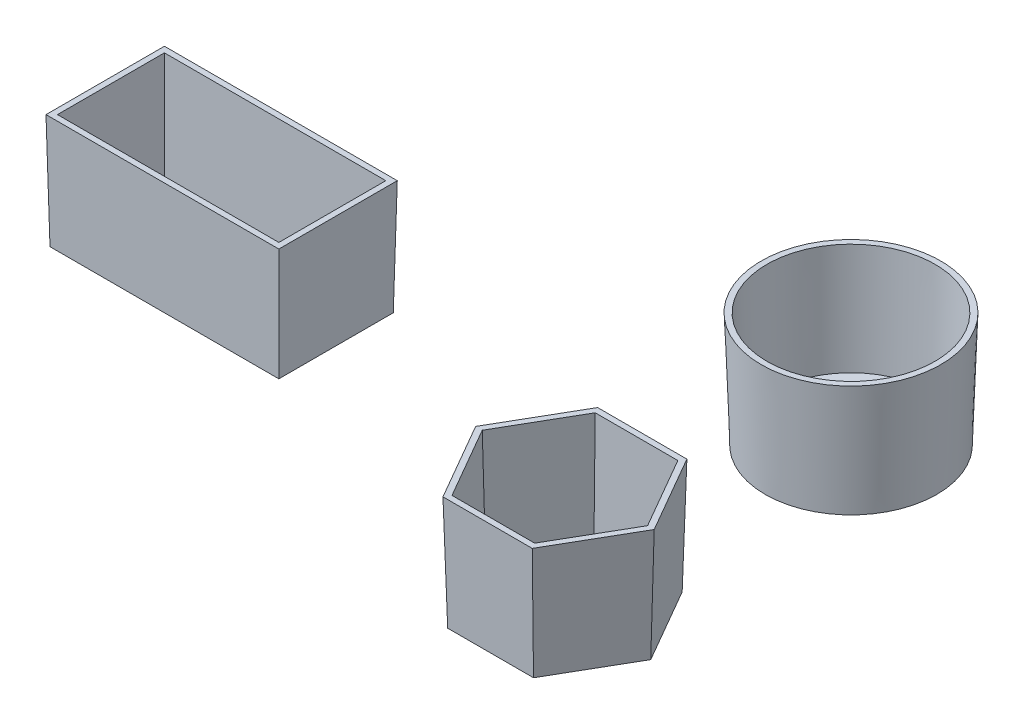
ISO-10303-21;
HEADER;
FILE_DESCRIPTION(('STEP AP214'),'2;1');
FILE_NAME('part.step','',(''),(''),'','','');
FILE_SCHEMA(('AUTOMOTIVE_DESIGN { 1 0 10303 214 1 1 1 1 }'));
ENDSEC;
DATA;
#1=APPLICATION_CONTEXT('core data for automotive mechanical design processes');
#2=APPLICATION_PROTOCOL_DEFINITION('international standard','automotive_design',2000,#1);
#3=PRODUCT_CONTEXT('',#1,'mechanical');
#4=PRODUCT('Part','Part','',(#3));
#5=PRODUCT_RELATED_PRODUCT_CATEGORY('part','',(#4));
#6=PRODUCT_DEFINITION_FORMATION('','',#4);
#7=PRODUCT_DEFINITION_CONTEXT('part definition',#1,'design');
#8=PRODUCT_DEFINITION('design','',#6,#7);
#9=PRODUCT_DEFINITION_SHAPE('','',#8);
#10=(LENGTH_UNIT() NAMED_UNIT(*) SI_UNIT(.MILLI.,.METRE.));
#11=(NAMED_UNIT(*) PLANE_ANGLE_UNIT() SI_UNIT($,.RADIAN.));
#12=(NAMED_UNIT(*) SI_UNIT($,.STERADIAN.) SOLID_ANGLE_UNIT());
#13=UNCERTAINTY_MEASURE_WITH_UNIT(LENGTH_MEASURE(1.E-05),#10,'distance_accuracy_value','');
#14=(GEOMETRIC_REPRESENTATION_CONTEXT(3) GLOBAL_UNCERTAINTY_ASSIGNED_CONTEXT((#13)) GLOBAL_UNIT_ASSIGNED_CONTEXT((#10,
#11,#12)) REPRESENTATION_CONTEXT('',''));
#15=CARTESIAN_POINT('',(0.,0.,0.));
#16=DIRECTION('',(0.,0.,1.));
#17=DIRECTION('',(1.,0.,0.));
#18=AXIS2_PLACEMENT_3D('',#15,#16,#17);
#19=CARTESIAN_POINT('',(0.,0.,32.9903810567666));
#20=DIRECTION('',(0.,-0.0261769483078732,0.999657324975557));
#21=DIRECTION('',(0.,-0.999657324975557,-0.0261769483078732));
#22=AXIS2_PLACEMENT_3D('',#19,#20,#21);
#23=PLANE('',#22);
#24=DIRECTION('',(1.,0.,0.));
#25=VECTOR('',#24,1.);
#26=CARTESIAN_POINT('',(0.,0.,32.9903810567666));
#27=LINE('',#26,#25);
#28=CARTESIAN_POINT('',(27.5,0.,32.9903810567666));
#29=VERTEX_POINT('',#28);
#30=CARTESIAN_POINT('',(42.5,0.,32.9903810567666));
#31=VERTEX_POINT('',#30);
#32=EDGE_CURVE('E200',#29,#31,#27,.T.);
#33=ORIENTED_EDGE('',*,*,#32,.T.);
#34=DIRECTION('',(-0.0151115424303425,-0.999543178227686,-0.0261739592700861));
#35=VECTOR('',#34,1.);
#36=CARTESIAN_POINT('',(42.4983282981855,-0.110573632868768,32.9874855842887));
#37=LINE('',#36,#35);
#38=CARTESIAN_POINT('',(42.802368977339,20.,33.5140994881503));
#39=VERTEX_POINT('',#38);
#40=EDGE_CURVE('E12',#39,#31,#37,.T.);
#41=ORIENTED_EDGE('',*,*,#40,.F.);
#42=DIRECTION('',(-1.,0.,0.));
#43=VECTOR('',#42,1.);
#44=CARTESIAN_POINT('',(0.,20.,33.5140994881503));
#45=LINE('',#44,#43);
#46=CARTESIAN_POINT('',(27.197631022661,20.,33.5140994881503));
#47=VERTEX_POINT('',#46);
#48=EDGE_CURVE('E212',#47,#39,#45,.F.);
#49=ORIENTED_EDGE('',*,*,#48,.F.);
#50=DIRECTION('',(0.0151115424303425,-0.999543178227686,-0.0261739592700861));
#51=VECTOR('',#50,1.);
#52=CARTESIAN_POINT('',(27.4937201353478,0.415377576590544,33.0012581014088));
#53=LINE('',#52,#51);
#54=EDGE_CURVE('E214',#47,#29,#53,.T.);
#55=ORIENTED_EDGE('',*,*,#54,.T.);
#56=EDGE_LOOP('',(#33,#41,#49,#55));
#57=FACE_BOUND('',#56,.T.);
#58=ADVANCED_FACE('F59',(#57),#23,.T.);
#59=CARTESIAN_POINT('',(46.1602540378444,0.,26.6506350946109));
#60=DIRECTION('',(0.865728638508029,-0.0261769483078732,0.499828662487778));
#61=DIRECTION('',(0.499999999999999,0.,-0.866025403784439));
#62=AXIS2_PLACEMENT_3D('',#59,#60,#61);
#63=PLANE('',#62);
#64=DIRECTION('',(0.499999999999999,0.,-0.866025403784439));
#65=VECTOR('',#64,1.);
#66=CARTESIAN_POINT('',(46.1602540378444,0.,26.6506350946109));
#67=LINE('',#66,#65);
#68=CARTESIAN_POINT('',(50.,0.,20.));
#69=VERTEX_POINT('',#68);
#70=EDGE_CURVE('E203',#31,#69,#67,.T.);
#71=ORIENTED_EDGE('',*,*,#70,.T.);
#72=DIRECTION('',(-0.030223084860685,-0.999543178227686,0.));
#73=VECTOR('',#72,1.);
#74=CARTESIAN_POINT('',(49.9806714863472,-0.639236003074915,20.));
#75=LINE('',#74,#73);
#76=CARTESIAN_POINT('',(50.6047379546779,20.,20.));
#77=VERTEX_POINT('',#76);
#78=EDGE_CURVE('E68',#77,#69,#75,.T.);
#79=ORIENTED_EDGE('',*,*,#78,.F.);
#80=DIRECTION('',(-0.499999999999999,0.,0.866025403784439));
#81=VECTOR('',#80,1.);
#82=CARTESIAN_POINT('',(46.6138075038529,20.,26.9124943103028));
#83=LINE('',#82,#81);
#84=EDGE_CURVE('E229',#39,#77,#83,.F.);
#85=ORIENTED_EDGE('',*,*,#84,.F.);
#86=ORIENTED_EDGE('',*,*,#40,.T.);
#87=EDGE_LOOP('',(#71,#79,#85,#86));
#88=FACE_BOUND('',#87,.T.);
#89=ADVANCED_FACE('F61',(#88),#63,.T.);
#90=CARTESIAN_POINT('',(28.8397459621556,0.,-16.650635094611));
#91=DIRECTION('',(0.865728638508029,-0.0261769483078732,-0.499828662487779));
#92=DIRECTION('',(-0.5,0.,-0.866025403784439));
#93=AXIS2_PLACEMENT_3D('',#90,#91,#92);
#94=PLANE('',#93);
#95=DIRECTION('',(-0.5,0.,-0.866025403784439));
#96=VECTOR('',#95,1.);
#97=CARTESIAN_POINT('',(28.8397459621556,0.,-16.650635094611));
#98=LINE('',#97,#96);
#99=CARTESIAN_POINT('',(42.5,0.,7.00961894323341));
#100=VERTEX_POINT('',#99);
#101=EDGE_CURVE('E205',#69,#100,#98,.T.);
#102=ORIENTED_EDGE('',*,*,#101,.T.);
#103=DIRECTION('',(-0.0151115424303425,-0.999543178227686,0.0261739592700861));
#104=VECTOR('',#103,1.);
#105=CARTESIAN_POINT('',(42.4902947546285,-0.64194716382175,7.0264289213168));
#106=LINE('',#105,#104);
#107=CARTESIAN_POINT('',(42.802368977339,20.,6.48590051184967));
#108=VERTEX_POINT('',#107);
#109=EDGE_CURVE('E223',#108,#100,#106,.T.);
#110=ORIENTED_EDGE('',*,*,#109,.F.);
#111=DIRECTION('',(0.5,0.,0.866025403784439));
#112=VECTOR('',#111,1.);
#113=CARTESIAN_POINT('',(29.2932994281641,20.,-16.9124943103028));
#114=LINE('',#113,#112);
#115=EDGE_CURVE('E231',#77,#108,#114,.F.);
#116=ORIENTED_EDGE('',*,*,#115,.F.);
#117=ORIENTED_EDGE('',*,*,#78,.T.);
#118=EDGE_LOOP('',(#102,#110,#116,#117));
#119=FACE_BOUND('',#118,.T.);
#120=ADVANCED_FACE('F256',(#119),#94,.T.);
#121=CARTESIAN_POINT('',(0.,0.,7.00961894323341));
#122=DIRECTION('',(0.,-0.0261769483078732,-0.999657324975557));
#123=DIRECTION('',(0.,0.999657324975557,-0.0261769483078732));
#124=AXIS2_PLACEMENT_3D('',#121,#122,#123);
#125=PLANE('',#124);
#126=DIRECTION('',(-1.,0.,0.));
#127=VECTOR('',#126,1.);
#128=CARTESIAN_POINT('',(0.,0.,7.00961894323341));
#129=LINE('',#128,#127);
#130=CARTESIAN_POINT('',(27.5,0.,7.00961894323341));
#131=VERTEX_POINT('',#130);
#132=EDGE_CURVE('E207',#100,#131,#129,.T.);
#133=ORIENTED_EDGE('',*,*,#132,.T.);
#134=DIRECTION('',(0.0151115424303425,-0.999543178227686,0.0261739592700861));
#135=VECTOR('',#134,1.);
#136=CARTESIAN_POINT('',(27.5017536789048,-0.115995954362438,7.01265640419668));
#137=LINE('',#136,#135);
#138=CARTESIAN_POINT('',(27.197631022661,20.,6.48590051184967));
#139=VERTEX_POINT('',#138);
#140=EDGE_CURVE('E220',#139,#131,#137,.T.);
#141=ORIENTED_EDGE('',*,*,#140,.F.);
#142=DIRECTION('',(1.,0.,0.));
#143=VECTOR('',#142,1.);
#144=CARTESIAN_POINT('',(0.,20.,6.48590051184967));
#145=LINE('',#144,#143);
#146=EDGE_CURVE('E233',#108,#139,#145,.F.);
#147=ORIENTED_EDGE('',*,*,#146,.F.);
#148=ORIENTED_EDGE('',*,*,#109,.T.);
#149=EDGE_LOOP('',(#133,#141,#147,#148));
#150=FACE_BOUND('',#149,.T.);
#151=ADVANCED_FACE('F259',(#150),#125,.T.);
#152=CARTESIAN_POINT('',(23.6602540378444,0.,13.6602540378444));
#153=DIRECTION('',(-0.865728638508029,-0.0261769483078732,-0.499828662487779));
#154=DIRECTION('',(-0.5,0.,0.866025403784439));
#155=AXIS2_PLACEMENT_3D('',#152,#153,#154);
#156=PLANE('',#155);
#157=DIRECTION('',(-0.5,0.,0.866025403784439));
#158=VECTOR('',#157,1.);
#159=CARTESIAN_POINT('',(23.6602540378444,0.,13.6602540378444));
#160=LINE('',#159,#158);
#161=CARTESIAN_POINT('',(20.,0.,20.));
#162=VERTEX_POINT('',#161);
#163=EDGE_CURVE('E209',#131,#162,#160,.T.);
#164=ORIENTED_EDGE('',*,*,#163,.T.);
#165=DIRECTION('',(0.030223084860685,-0.999543178227686,0.));
#166=VECTOR('',#165,1.);
#167=CARTESIAN_POINT('',(19.9875222477859,0.412666415843709,20.));
#168=LINE('',#167,#166);
#169=CARTESIAN_POINT('',(19.3952620453221,20.,20.));
#170=VERTEX_POINT('',#169);
#171=EDGE_CURVE('E217',#170,#162,#168,.T.);
#172=ORIENTED_EDGE('',*,*,#171,.F.);
#173=DIRECTION('',(0.5,0.,-0.866025403784439));
#174=VECTOR('',#173,1.);
#175=CARTESIAN_POINT('',(23.2067005718359,20.,13.3983948221525));
#176=LINE('',#175,#174);
#177=EDGE_CURVE('E234',#139,#170,#176,.F.);
#178=ORIENTED_EDGE('',*,*,#177,.F.);
#179=ORIENTED_EDGE('',*,*,#140,.T.);
#180=EDGE_LOOP('',(#164,#172,#178,#179));
#181=FACE_BOUND('',#180,.T.);
#182=ADVANCED_FACE('F241',(#181),#156,.T.);
#183=CARTESIAN_POINT('',(6.3397459621556,0.,-3.66025403784438));
#184=DIRECTION('',(-0.865728638508029,-0.0261769483078732,0.499828662487779));
#185=DIRECTION('',(0.5,0.,0.866025403784439));
#186=AXIS2_PLACEMENT_3D('',#183,#184,#185);
#187=PLANE('',#186);
#188=DIRECTION('',(0.5,0.,0.866025403784439));
#189=VECTOR('',#188,1.);
#190=CARTESIAN_POINT('',(6.3397459621556,0.,-3.66025403784438));
#191=LINE('',#190,#189);
#192=EDGE_CURVE('E211',#162,#29,#191,.T.);
#193=ORIENTED_EDGE('',*,*,#192,.T.);
#194=ORIENTED_EDGE('',*,*,#54,.F.);
#195=DIRECTION('',(-0.5,0.,-0.866025403784439));
#196=VECTOR('',#195,1.);
#197=CARTESIAN_POINT('',(5.88619249614715,20.,-3.39839482215251));
#198=LINE('',#197,#196);
#199=EDGE_CURVE('E63',#170,#47,#198,.F.);
#200=ORIENTED_EDGE('',*,*,#199,.F.);
#201=ORIENTED_EDGE('',*,*,#171,.T.);
#202=EDGE_LOOP('',(#193,#194,#200,#201));
#203=FACE_BOUND('',#202,.T.);
#204=ADVANCED_FACE('F245',(#203),#187,.T.);
#205=CARTESIAN_POINT('',(0.,20.,0.));
#206=DIRECTION('',(0.,1.,0.));
#207=DIRECTION('',(0.,0.,1.));
#208=AXIS2_PLACEMENT_3D('',#205,#206,#207);
#209=PLANE('',#208);
#210=DIRECTION('',(-1.,0.,0.));
#211=VECTOR('',#210,1.);
#212=CARTESIAN_POINT('',(0.,20.,32.5137566956595));
#213=LINE('',#212,#211);
#214=CARTESIAN_POINT('',(27.7751792031875,20.,32.5137566956595));
#215=VERTEX_POINT('',#214);
#216=CARTESIAN_POINT('',(42.2248207968125,20.,32.5137566956595));
#217=VERTEX_POINT('',#216);
#218=EDGE_CURVE('E189',#215,#217,#213,.F.);
#219=ORIENTED_EDGE('',*,*,#218,.F.);
#220=DIRECTION('',(-0.5,0.,-0.866025403784439));
#221=VECTOR('',#220,1.);
#222=CARTESIAN_POINT('',(6.75251476693691,20.,-3.89856621839795));
#223=LINE('',#222,#221);
#224=CARTESIAN_POINT('',(20.5503584063751,20.,20.));
#225=VERTEX_POINT('',#224);
#226=EDGE_CURVE('E198',#225,#215,#223,.F.);
#227=ORIENTED_EDGE('',*,*,#226,.F.);
#228=DIRECTION('',(0.5,0.,-0.866025403784439));
#229=VECTOR('',#228,1.);
#230=CARTESIAN_POINT('',(24.0730228426257,20.,13.8985662183979));
#231=LINE('',#230,#229);
#232=CARTESIAN_POINT('',(27.7751792031875,20.,7.48624330434053));
#233=VERTEX_POINT('',#232);
#234=EDGE_CURVE('E196',#233,#225,#231,.F.);
#235=ORIENTED_EDGE('',*,*,#234,.F.);
#236=DIRECTION('',(1.,0.,0.));
#237=VECTOR('',#236,1.);
#238=CARTESIAN_POINT('',(0.,20.,7.48624330434053));
#239=LINE('',#238,#237);
#240=CARTESIAN_POINT('',(42.2248207968125,20.,7.48624330434053));
#241=VERTEX_POINT('',#240);
#242=EDGE_CURVE('E194',#241,#233,#239,.F.);
#243=ORIENTED_EDGE('',*,*,#242,.F.);
#244=DIRECTION('',(0.5,0.,0.866025403784439));
#245=VECTOR('',#244,1.);
#246=CARTESIAN_POINT('',(28.4269771573743,20.,-16.4123229140574));
#247=LINE('',#246,#245);
#248=CARTESIAN_POINT('',(49.4496415936249,20.,20.));
#249=VERTEX_POINT('',#248);
#250=EDGE_CURVE('E192',#249,#241,#247,.F.);
#251=ORIENTED_EDGE('',*,*,#250,.F.);
#252=DIRECTION('',(-0.499999999999999,0.,0.866025403784439));
#253=VECTOR('',#252,1.);
#254=CARTESIAN_POINT('',(45.7474852330631,20.,26.4123229140574));
#255=LINE('',#254,#253);
#256=EDGE_CURVE('E166',#217,#249,#255,.F.);
#257=ORIENTED_EDGE('',*,*,#256,.F.);
#258=EDGE_LOOP('',(#219,#227,#235,#243,#251,#257));
#259=FACE_BOUND('',#258,.T.);
#260=ORIENTED_EDGE('',*,*,#48,.T.);
#261=ORIENTED_EDGE('',*,*,#84,.T.);
#262=ORIENTED_EDGE('',*,*,#115,.T.);
#263=ORIENTED_EDGE('',*,*,#146,.T.);
#264=ORIENTED_EDGE('',*,*,#177,.T.);
#265=ORIENTED_EDGE('',*,*,#199,.T.);
#266=EDGE_LOOP('',(#260,#261,#262,#263,#264,#265));
#267=FACE_BOUND('',#266,.T.);
#268=ADVANCED_FACE('F237',(#259,#267),#209,.T.);
#269=CARTESIAN_POINT('',(0.,0.,0.));
#270=DIRECTION('',(0.,1.,0.));
#271=DIRECTION('',(0.,0.,1.));
#272=AXIS2_PLACEMENT_3D('',#269,#270,#271);
#273=PLANE('',#272);
#274=ORIENTED_EDGE('',*,*,#32,.F.);
#275=ORIENTED_EDGE('',*,*,#192,.F.);
#276=ORIENTED_EDGE('',*,*,#163,.F.);
#277=ORIENTED_EDGE('',*,*,#132,.F.);
#278=ORIENTED_EDGE('',*,*,#101,.F.);
#279=ORIENTED_EDGE('',*,*,#70,.F.);
#280=EDGE_LOOP('',(#274,#275,#276,#277,#278,#279));
#281=FACE_BOUND('',#280,.T.);
#282=ADVANCED_FACE('F261',(#281),#273,.F.);
#283=CARTESIAN_POINT('',(0.,0.0261769483078732,31.990723731791));
#284=DIRECTION('',(0.,-0.0261769483078732,0.999657324975557));
#285=DIRECTION('',(0.,-0.999657324975557,-0.0261769483078732));
#286=AXIS2_PLACEMENT_3D('',#283,#284,#285);
#287=PLANE('',#286);
#288=DIRECTION('',(-1.,0.,0.));
#289=VECTOR('',#288,1.);
#290=CARTESIAN_POINT('',(0.,1.,32.0162241858449));
#291=LINE('',#290,#289);
#292=CARTESIAN_POINT('',(28.0624297316596,1.,32.0162241858449));
#293=VERTEX_POINT('',#292);
#294=CARTESIAN_POINT('',(41.9375702683405,1.,32.0162241858449));
#295=VERTEX_POINT('',#294);
#296=EDGE_CURVE('E157',#293,#295,#291,.F.);
#297=ORIENTED_EDGE('',*,*,#296,.F.);
#298=DIRECTION('',(0.0151115424303425,-0.999543178227686,-0.0261739592700861));
#299=VECTOR('',#298,1.);
#300=CARTESIAN_POINT('',(28.0707407632338,0.450272204022017,32.001829056895));
#301=LINE('',#300,#299);
#302=EDGE_CURVE('E187',#215,#293,#301,.T.);
#303=ORIENTED_EDGE('',*,*,#302,.F.);
#304=ORIENTED_EDGE('',*,*,#218,.T.);
#305=DIRECTION('',(-0.0151115424303425,-0.999543178227686,-0.0261739592700861));
#306=VECTOR('',#305,1.);
#307=CARTESIAN_POINT('',(41.9213076702995,-0.0756790054372952,31.9880565397749));
#308=LINE('',#307,#306);
#309=EDGE_CURVE('E169',#217,#295,#308,.T.);
#310=ORIENTED_EDGE('',*,*,#309,.T.);
#311=EDGE_LOOP('',(#297,#303,#304,#310));
#312=FACE_BOUND('',#311,.T.);
#313=ADVANCED_FACE('F263',(#312),#287,.F.);
#314=CARTESIAN_POINT('',(45.2945253993364,0.0261769483078732,26.1508064321232));
#315=DIRECTION('',(0.865728638508029,-0.0261769483078732,0.499828662487778));
#316=DIRECTION('',(0.499999999999999,0.,-0.866025403784439));
#317=AXIS2_PLACEMENT_3D('',#314,#315,#316);
#318=PLANE('',#317);
#319=DIRECTION('',(-0.499999999999999,0.,0.866025403784439));
#320=VECTOR('',#319,1.);
#321=CARTESIAN_POINT('',(45.3166094403551,1.,26.1635566591501));
#322=LINE('',#321,#320);
#323=CARTESIAN_POINT('',(48.8751405366809,1.,20.));
#324=VERTEX_POINT('',#323);
#325=EDGE_CURVE('E150',#295,#324,#322,.F.);
#326=ORIENTED_EDGE('',*,*,#325,.F.);
#327=ORIENTED_EDGE('',*,*,#309,.F.);
#328=ORIENTED_EDGE('',*,*,#256,.T.);
#329=DIRECTION('',(-0.030223084860685,-0.999543178227686,0.));
#330=VECTOR('',#329,1.);
#331=CARTESIAN_POINT('',(48.8266302305753,-0.604341375643442,20.));
#332=LINE('',#331,#330);
#333=EDGE_CURVE('E163',#249,#324,#332,.T.);
#334=ORIENTED_EDGE('',*,*,#333,.T.);
#335=EDGE_LOOP('',(#326,#327,#328,#334));
#336=FACE_BOUND('',#335,.T.);
#337=ADVANCED_FACE('F164',(#336),#318,.F.);
#338=CARTESIAN_POINT('',(27.9740173236476,0.0261769483078732,-16.1508064321232));
#339=DIRECTION('',(0.865728638508029,-0.0261769483078732,-0.499828662487779));
#340=DIRECTION('',(-0.5,0.,-0.866025403784439));
#341=AXIS2_PLACEMENT_3D('',#338,#339,#340);
#342=PLANE('',#341);
#343=DIRECTION('',(0.5,0.,0.866025403784439));
#344=VECTOR('',#343,1.);
#345=CARTESIAN_POINT('',(27.9961013646663,1.,-16.1635566591501));
#346=LINE('',#345,#344);
#347=CARTESIAN_POINT('',(41.9375702683404,1.,7.98377581415509));
#348=VERTEX_POINT('',#347);
#349=EDGE_CURVE('E154',#324,#348,#346,.F.);
#350=ORIENTED_EDGE('',*,*,#349,.F.);
#351=ORIENTED_EDGE('',*,*,#333,.F.);
#352=ORIENTED_EDGE('',*,*,#250,.T.);
#353=DIRECTION('',(-0.0151115424303425,-0.999543178227686,0.0261739592700861));
#354=VECTOR('',#353,1.);
#355=CARTESIAN_POINT('',(41.9132741267425,-0.607052536390277,8.02585796583057));
#356=LINE('',#355,#354);
#357=EDGE_CURVE('E170',#241,#348,#356,.T.);
#358=ORIENTED_EDGE('',*,*,#357,.T.);
#359=EDGE_LOOP('',(#350,#351,#352,#358));
#360=FACE_BOUND('',#359,.T.);
#361=ADVANCED_FACE('F172',(#360),#342,.F.);
#362=CARTESIAN_POINT('',(0.,0.0261769483078732,8.00927626820896));
#363=DIRECTION('',(0.,-0.0261769483078732,-0.999657324975557));
#364=DIRECTION('',(0.,0.999657324975557,-0.0261769483078732));
#365=AXIS2_PLACEMENT_3D('',#362,#363,#364);
#366=PLANE('',#365);
#367=DIRECTION('',(1.,0.,0.));
#368=VECTOR('',#367,1.);
#369=CARTESIAN_POINT('',(0.,1.,7.98377581415509));
#370=LINE('',#369,#368);
#371=CARTESIAN_POINT('',(28.0624297316596,1.,7.98377581415509));
#372=VERTEX_POINT('',#371);
#373=EDGE_CURVE('E175',#348,#372,#370,.F.);
#374=ORIENTED_EDGE('',*,*,#373,.F.);
#375=ORIENTED_EDGE('',*,*,#357,.F.);
#376=ORIENTED_EDGE('',*,*,#242,.T.);
#377=DIRECTION('',(0.0151115424303425,-0.999543178227686,0.0261739592700861));
#378=VECTOR('',#377,1.);
#379=CARTESIAN_POINT('',(28.0787743067907,-0.0811013269309654,8.01208544871044));
#380=LINE('',#379,#378);
#381=EDGE_CURVE('E180',#233,#372,#380,.T.);
#382=ORIENTED_EDGE('',*,*,#381,.T.);
#383=EDGE_LOOP('',(#374,#375,#376,#382));
#384=FACE_BOUND('',#383,.T.);
#385=ADVANCED_FACE('F332',(#384),#366,.F.);
#386=CARTESIAN_POINT('',(24.5259826763524,0.0261769483078732,14.1600827003322));
#387=DIRECTION('',(-0.865728638508029,-0.0261769483078732,-0.499828662487779));
#388=DIRECTION('',(-0.5,0.,0.866025403784439));
#389=AXIS2_PLACEMENT_3D('',#386,#387,#388);
#390=PLANE('',#389);
#391=DIRECTION('',(0.5,0.,-0.866025403784439));
#392=VECTOR('',#391,1.);
#393=CARTESIAN_POINT('',(24.5038986353337,1.,14.1473324733052));
#394=LINE('',#393,#392);
#395=CARTESIAN_POINT('',(21.1248594633191,1.,20.));
#396=VERTEX_POINT('',#395);
#397=EDGE_CURVE('E177',#372,#396,#394,.F.);
#398=ORIENTED_EDGE('',*,*,#397,.F.);
#399=ORIENTED_EDGE('',*,*,#381,.F.);
#400=ORIENTED_EDGE('',*,*,#234,.T.);
#401=DIRECTION('',(0.030223084860685,-0.999543178227686,0.));
#402=VECTOR('',#401,1.);
#403=CARTESIAN_POINT('',(21.1415635035578,0.447561043275182,20.));
#404=LINE('',#403,#402);
#405=EDGE_CURVE('E76',#225,#396,#404,.T.);
#406=ORIENTED_EDGE('',*,*,#405,.T.);
#407=EDGE_LOOP('',(#398,#399,#400,#406));
#408=FACE_BOUND('',#407,.T.);
#409=ADVANCED_FACE('F341',(#408),#390,.F.);
#410=CARTESIAN_POINT('',(7.20547460066363,0.0261769483078732,-4.16008270033216));
#411=DIRECTION('',(-0.865728638508029,-0.0261769483078732,0.499828662487779));
#412=DIRECTION('',(0.5,0.,0.866025403784439));
#413=AXIS2_PLACEMENT_3D('',#410,#411,#412);
#414=PLANE('',#413);
#415=DIRECTION('',(-0.5,0.,-0.866025403784439));
#416=VECTOR('',#415,1.);
#417=CARTESIAN_POINT('',(7.18339055964494,1.,-4.14733247330522));
#418=LINE('',#417,#416);
#419=EDGE_CURVE('E185',#396,#293,#418,.F.);
#420=ORIENTED_EDGE('',*,*,#419,.F.);
#421=ORIENTED_EDGE('',*,*,#405,.F.);
#422=ORIENTED_EDGE('',*,*,#226,.T.);
#423=ORIENTED_EDGE('',*,*,#302,.T.);
#424=EDGE_LOOP('',(#420,#421,#422,#423));
#425=FACE_BOUND('',#424,.T.);
#426=ADVANCED_FACE('F351',(#425),#414,.F.);
#427=CARTESIAN_POINT('',(0.,1.,0.));
#428=DIRECTION('',(0.,1.,0.));
#429=DIRECTION('',(0.,0.,1.));
#430=AXIS2_PLACEMENT_3D('',#427,#428,#429);
#431=PLANE('',#430);
#432=ORIENTED_EDGE('',*,*,#296,.T.);
#433=ORIENTED_EDGE('',*,*,#325,.T.);
#434=ORIENTED_EDGE('',*,*,#349,.T.);
#435=ORIENTED_EDGE('',*,*,#373,.T.);
#436=ORIENTED_EDGE('',*,*,#397,.T.);
#437=ORIENTED_EDGE('',*,*,#419,.T.);
#438=EDGE_LOOP('',(#432,#433,#434,#435,#436,#437));
#439=FACE_BOUND('',#438,.T.);
#440=ADVANCED_FACE('F152',(#439),#431,.T.);
#441=CLOSED_SHELL('',(#58,#89,#120,#151,#182,#204,#268,#282,#313,#337,#361,#385,#409,#426,#440));
#442=MANIFOLD_SOLID_BREP('B2',#441);
#443=CARTESIAN_POINT('',(35.,0.,-30.));
#444=DIRECTION('',(0.,1.,0.));
#445=DIRECTION('',(0.,0.,1.));
#446=AXIS2_PLACEMENT_3D('',#443,#444,#445);
#447=CONICAL_SURFACE('',#446,15.,0.0349065850398867);
#448=CARTESIAN_POINT('',(35.,20.,-30.));
#449=DIRECTION('',(0.,1.,0.));
#450=DIRECTION('',(0.,0.,1.));
#451=AXIS2_PLACEMENT_3D('',#448,#449,#450);
#452=CIRCLE('',#451,15.698415389835);
#453=CARTESIAN_POINT('',(35.,20.,-14.301584610165));
#454=VERTEX_POINT('',#453);
#455=EDGE_CURVE('E58',#454,#454,#452,.T.);
#456=ORIENTED_EDGE('',*,*,#455,.F.);
#457=EDGE_LOOP('',(#456));
#458=FACE_BOUND('',#457,.T.);
#459=CARTESIAN_POINT('',(35.,0.,-30.));
#460=DIRECTION('',(0.,1.,0.));
#461=DIRECTION('',(0.,0.,1.));
#462=AXIS2_PLACEMENT_3D('',#459,#460,#461);
#463=CIRCLE('',#462,15.);
#464=CARTESIAN_POINT('',(35.,0.,-15.));
#465=VERTEX_POINT('',#464);
#466=EDGE_CURVE('E498',#465,#465,#463,.T.);
#467=ORIENTED_EDGE('',*,*,#466,.T.);
#468=EDGE_LOOP('',(#467));
#469=FACE_BOUND('',#468,.T.);
#470=ADVANCED_FACE('F492',(#458,#469),#447,.T.);
#471=CARTESIAN_POINT('',(0.,20.,0.));
#472=DIRECTION('',(0.,1.,0.));
#473=DIRECTION('',(0.,0.,1.));
#474=AXIS2_PLACEMENT_3D('',#471,#472,#473);
#475=PLANE('',#474);
#476=CARTESIAN_POINT('',(35.,20.,-30.));
#477=DIRECTION('',(0.,1.,0.));
#478=DIRECTION('',(0.,0.,1.));
#479=AXIS2_PLACEMENT_3D('',#476,#477,#478);
#480=CIRCLE('',#479,14.6978058455361);
#481=CARTESIAN_POINT('',(35.,20.,-15.3021941544639));
#482=VERTEX_POINT('',#481);
#483=EDGE_CURVE('E502',#482,#482,#480,.T.);
#484=ORIENTED_EDGE('',*,*,#483,.F.);
#485=EDGE_LOOP('',(#484));
#486=FACE_BOUND('',#485,.T.);
#487=ORIENTED_EDGE('',*,*,#455,.T.);
#488=EDGE_LOOP('',(#487));
#489=FACE_BOUND('',#488,.T.);
#490=ADVANCED_FACE('F524',(#486,#489),#475,.T.);
#491=CARTESIAN_POINT('',(0.,0.,0.));
#492=DIRECTION('',(0.,1.,0.));
#493=DIRECTION('',(0.,0.,1.));
#494=AXIS2_PLACEMENT_3D('',#491,#492,#493);
#495=PLANE('',#494);
#496=ORIENTED_EDGE('',*,*,#466,.F.);
#497=EDGE_LOOP('',(#496));
#498=FACE_BOUND('',#497,.T.);
#499=ADVANCED_FACE('F516',(#498),#495,.F.);
#500=CARTESIAN_POINT('',(35.,0.034899496702501,-30.));
#501=DIRECTION('',(0.,1.,0.));
#502=DIRECTION('',(0.,0.,1.));
#503=AXIS2_PLACEMENT_3D('',#500,#501,#502);
#504=CONICAL_SURFACE('',#503,14.0006091729809,0.0349065850398867);
#505=ORIENTED_EDGE('',*,*,#483,.T.);
#506=EDGE_LOOP('',(#505));
#507=FACE_BOUND('',#506,.T.);
#508=CARTESIAN_POINT('',(35.,1.,-30.));
#509=DIRECTION('',(0.,1.,0.));
#510=DIRECTION('',(0.,0.,1.));
#511=AXIS2_PLACEMENT_3D('',#508,#509,#510);
#512=CIRCLE('',#511,14.0343112251929);
#513=CARTESIAN_POINT('',(35.,1.,-15.9656887748071));
#514=VERTEX_POINT('',#513);
#515=EDGE_CURVE('E506',#514,#514,#512,.T.);
#516=ORIENTED_EDGE('',*,*,#515,.F.);
#517=EDGE_LOOP('',(#516));
#518=FACE_BOUND('',#517,.T.);
#519=ADVANCED_FACE('F514',(#507,#518),#504,.F.);
#520=CARTESIAN_POINT('',(0.,1.,0.));
#521=DIRECTION('',(0.,1.,0.));
#522=DIRECTION('',(0.,0.,1.));
#523=AXIS2_PLACEMENT_3D('',#520,#521,#522);
#524=PLANE('',#523);
#525=ORIENTED_EDGE('',*,*,#515,.T.);
#526=EDGE_LOOP('',(#525));
#527=FACE_BOUND('',#526,.T.);
#528=ADVANCED_FACE('F512',(#527),#524,.T.);
#529=CLOSED_SHELL('',(#470,#490,#499,#519,#528));
#530=MANIFOLD_SOLID_BREP('B6',#529);
#531=CARTESIAN_POINT('',(0.,0.,10.));
#532=DIRECTION('',(0.,-0.0174524064372835,0.999847695156391));
#533=DIRECTION('',(0.,-0.999847695156391,-0.0174524064372835));
#534=AXIS2_PLACEMENT_3D('',#531,#532,#533);
#535=PLANE('',#534);
#536=DIRECTION('',(1.,0.,0.));
#537=VECTOR('',#536,1.);
#538=CARTESIAN_POINT('',(0.,0.,10.));
#539=LINE('',#538,#537);
#540=CARTESIAN_POINT('',(-65.,0.,10.));
#541=VERTEX_POINT('',#540);
#542=CARTESIAN_POINT('',(-25.,0.,10.));
#543=VERTEX_POINT('',#542);
#544=EDGE_CURVE('E708',#541,#543,#539,.T.);
#545=ORIENTED_EDGE('',*,*,#544,.T.);
#546=DIRECTION('',(-0.0174497491606827,-0.999695459881887,-0.0174497491606827));
#547=VECTOR('',#546,1.);
#548=CARTESIAN_POINT('',(-25.0030449374577,-0.174444350120123,9.99695506254229));
#549=LINE('',#548,#547);
#550=CARTESIAN_POINT('',(-24.6508987014357,20.,10.3491012985644));
#551=VERTEX_POINT('',#550);
#552=EDGE_CURVE('E490',#551,#543,#549,.T.);
#553=ORIENTED_EDGE('',*,*,#552,.F.);
#554=DIRECTION('',(-1.,0.,0.));
#555=VECTOR('',#554,1.);
#556=CARTESIAN_POINT('',(0.,20.,10.3491012985644));
#557=LINE('',#556,#555);
#558=CARTESIAN_POINT('',(-65.3491012985644,20.,10.3491012985644));
#559=VERTEX_POINT('',#558);
#560=EDGE_CURVE('E719',#559,#551,#557,.F.);
#561=ORIENTED_EDGE('',*,*,#560,.F.);
#562=DIRECTION('',(-0.0174497491606827,0.999695459881887,0.0174497491606827));
#563=VECTOR('',#562,1.);
#564=CARTESIAN_POINT('',(-64.9969550625423,-0.174444350120123,9.99695506254229));
#565=LINE('',#564,#563);
#566=EDGE_CURVE('E629',#559,#541,#565,.F.);
#567=ORIENTED_EDGE('',*,*,#566,.T.);
#568=EDGE_LOOP('',(#545,#553,#561,#567));
#569=FACE_BOUND('',#568,.T.);
#570=ADVANCED_FACE('F604',(#569),#535,.T.);
#571=CARTESIAN_POINT('',(-25.,0.,0.));
#572=DIRECTION('',(0.999847695156391,-0.0174524064372835,0.));
#573=DIRECTION('',(0.0174524064372835,0.999847695156391,0.));
#574=AXIS2_PLACEMENT_3D('',#571,#572,#573);
#575=PLANE('',#574);
#576=DIRECTION('',(0.,0.,-1.));
#577=VECTOR('',#576,1.);
#578=CARTESIAN_POINT('',(-25.,0.,0.));
#579=LINE('',#578,#577);
#580=CARTESIAN_POINT('',(-25.,0.,-10.));
#581=VERTEX_POINT('',#580);
#582=EDGE_CURVE('E711',#543,#581,#579,.T.);
#583=ORIENTED_EDGE('',*,*,#582,.T.);
#584=DIRECTION('',(0.0174497491606827,0.999695459881887,-0.0174497491606827));
#585=VECTOR('',#584,1.);
#586=CARTESIAN_POINT('',(-25.0030449374577,-0.174444350120123,-9.99695506254229));
#587=LINE('',#586,#585);
#588=CARTESIAN_POINT('',(-24.6508987014357,20.,-10.3491012985644));
#589=VERTEX_POINT('',#588);
#590=EDGE_CURVE('E613',#589,#581,#587,.F.);
#591=ORIENTED_EDGE('',*,*,#590,.F.);
#592=DIRECTION('',(0.,0.,1.));
#593=VECTOR('',#592,1.);
#594=CARTESIAN_POINT('',(-24.6508987014357,20.,0.));
#595=LINE('',#594,#593);
#596=EDGE_CURVE('E727',#551,#589,#595,.F.);
#597=ORIENTED_EDGE('',*,*,#596,.F.);
#598=ORIENTED_EDGE('',*,*,#552,.T.);
#599=EDGE_LOOP('',(#583,#591,#597,#598));
#600=FACE_BOUND('',#599,.T.);
#601=ADVANCED_FACE('F606',(#600),#575,.T.);
#602=CARTESIAN_POINT('',(0.,0.,-10.));
#603=DIRECTION('',(0.,-0.0174524064372835,-0.999847695156391));
#604=DIRECTION('',(0.,0.999847695156391,-0.0174524064372835));
#605=AXIS2_PLACEMENT_3D('',#602,#603,#604);
#606=PLANE('',#605);
#607=DIRECTION('',(1.,0.,0.));
#608=VECTOR('',#607,1.);
#609=CARTESIAN_POINT('',(0.,0.,-10.));
#610=LINE('',#609,#608);
#611=CARTESIAN_POINT('',(-65.,0.,-10.));
#612=VERTEX_POINT('',#611);
#613=EDGE_CURVE('E714',#612,#581,#610,.T.);
#614=ORIENTED_EDGE('',*,*,#613,.F.);
#615=DIRECTION('',(0.0174497491606827,-0.999695459881887,0.0174497491606827));
#616=VECTOR('',#615,1.);
#617=CARTESIAN_POINT('',(-64.9969550625423,-0.174444350120123,-9.99695506254229));
#618=LINE('',#617,#616);
#619=CARTESIAN_POINT('',(-65.3491012985644,20.,-10.3491012985644));
#620=VERTEX_POINT('',#619);
#621=EDGE_CURVE('E722',#620,#612,#618,.T.);
#622=ORIENTED_EDGE('',*,*,#621,.F.);
#623=DIRECTION('',(1.,0.,0.));
#624=VECTOR('',#623,1.);
#625=CARTESIAN_POINT('',(0.,20.,-10.3491012985644));
#626=LINE('',#625,#624);
#627=EDGE_CURVE('E728',#620,#589,#626,.T.);
#628=ORIENTED_EDGE('',*,*,#627,.T.);
#629=ORIENTED_EDGE('',*,*,#590,.T.);
#630=EDGE_LOOP('',(#614,#622,#628,#629));
#631=FACE_BOUND('',#630,.T.);
#632=ADVANCED_FACE('F740',(#631),#606,.T.);
#633=CARTESIAN_POINT('',(-65.,0.,0.));
#634=DIRECTION('',(-0.999847695156391,-0.0174524064372835,0.));
#635=DIRECTION('',(0.0174524064372835,-0.999847695156391,0.));
#636=AXIS2_PLACEMENT_3D('',#633,#634,#635);
#637=PLANE('',#636);
#638=DIRECTION('',(0.,0.,-1.));
#639=VECTOR('',#638,1.);
#640=CARTESIAN_POINT('',(-65.,0.,0.));
#641=LINE('',#640,#639);
#642=EDGE_CURVE('E717',#541,#612,#641,.T.);
#643=ORIENTED_EDGE('',*,*,#642,.F.);
#644=ORIENTED_EDGE('',*,*,#566,.F.);
#645=DIRECTION('',(0.,0.,-1.));
#646=VECTOR('',#645,1.);
#647=CARTESIAN_POINT('',(-65.3491012985644,20.,0.));
#648=LINE('',#647,#646);
#649=EDGE_CURVE('E608',#559,#620,#648,.T.);
#650=ORIENTED_EDGE('',*,*,#649,.T.);
#651=ORIENTED_EDGE('',*,*,#621,.T.);
#652=EDGE_LOOP('',(#643,#644,#650,#651));
#653=FACE_BOUND('',#652,.T.);
#654=ADVANCED_FACE('F733',(#653),#637,.T.);
#655=CARTESIAN_POINT('',(0.,20.,0.));
#656=DIRECTION('',(0.,1.,0.));
#657=DIRECTION('',(0.,0.,1.));
#658=AXIS2_PLACEMENT_3D('',#655,#656,#657);
#659=PLANE('',#658);
#660=DIRECTION('',(-1.,0.,0.));
#661=VECTOR('',#660,1.);
#662=CARTESIAN_POINT('',(0.,20.,9.34894897052045));
#663=LINE('',#662,#661);
#664=CARTESIAN_POINT('',(-64.3489489705204,20.,9.34894897052045));
#665=VERTEX_POINT('',#664);
#666=CARTESIAN_POINT('',(-25.6510510294796,20.,9.34894897052045));
#667=VERTEX_POINT('',#666);
#668=EDGE_CURVE('E698',#665,#667,#663,.F.);
#669=ORIENTED_EDGE('',*,*,#668,.F.);
#670=DIRECTION('',(0.,0.,-1.));
#671=VECTOR('',#670,1.);
#672=CARTESIAN_POINT('',(-64.3489489705204,20.,0.));
#673=LINE('',#672,#671);
#674=CARTESIAN_POINT('',(-64.3489489705204,20.,-9.34894897052045));
#675=VERTEX_POINT('',#674);
#676=EDGE_CURVE('E679',#665,#675,#673,.T.);
#677=ORIENTED_EDGE('',*,*,#676,.T.);
#678=DIRECTION('',(1.,0.,0.));
#679=VECTOR('',#678,1.);
#680=CARTESIAN_POINT('',(0.,20.,-9.34894897052045));
#681=LINE('',#680,#679);
#682=CARTESIAN_POINT('',(-25.6510510294796,20.,-9.34894897052045));
#683=VERTEX_POINT('',#682);
#684=EDGE_CURVE('E621',#675,#683,#681,.T.);
#685=ORIENTED_EDGE('',*,*,#684,.T.);
#686=DIRECTION('',(0.,0.,1.));
#687=VECTOR('',#686,1.);
#688=CARTESIAN_POINT('',(-25.6510510294796,20.,0.));
#689=LINE('',#688,#687);
#690=EDGE_CURVE('E700',#667,#683,#689,.F.);
#691=ORIENTED_EDGE('',*,*,#690,.F.);
#692=EDGE_LOOP('',(#669,#677,#685,#691));
#693=FACE_BOUND('',#692,.T.);
#694=ORIENTED_EDGE('',*,*,#560,.T.);
#695=ORIENTED_EDGE('',*,*,#596,.T.);
#696=ORIENTED_EDGE('',*,*,#627,.F.);
#697=ORIENTED_EDGE('',*,*,#649,.F.);
#698=EDGE_LOOP('',(#694,#695,#696,#697));
#699=FACE_BOUND('',#698,.T.);
#700=ADVANCED_FACE('F736',(#693,#699),#659,.T.);
#701=CARTESIAN_POINT('',(0.,0.,0.));
#702=DIRECTION('',(0.,1.,0.));
#703=DIRECTION('',(0.,0.,1.));
#704=AXIS2_PLACEMENT_3D('',#701,#702,#703);
#705=PLANE('',#704);
#706=ORIENTED_EDGE('',*,*,#544,.F.);
#707=ORIENTED_EDGE('',*,*,#642,.T.);
#708=ORIENTED_EDGE('',*,*,#613,.T.);
#709=ORIENTED_EDGE('',*,*,#582,.F.);
#710=EDGE_LOOP('',(#706,#707,#708,#709));
#711=FACE_BOUND('',#710,.T.);
#712=ADVANCED_FACE('F743',(#711),#705,.F.);
#713=CARTESIAN_POINT('',(0.,0.0174524064372835,9.00015230484361));
#714=DIRECTION('',(0.,-0.0174524064372835,0.999847695156391));
#715=DIRECTION('',(0.,-0.999847695156391,-0.0174524064372835));
#716=AXIS2_PLACEMENT_3D('',#713,#714,#715);
#717=PLANE('',#716);
#718=DIRECTION('',(-1.,0.,0.));
#719=VECTOR('',#718,1.);
#720=CARTESIAN_POINT('',(0.,1.,9.01730273688431));
#721=LINE('',#720,#719);
#722=CARTESIAN_POINT('',(-64.0173027368843,1.,9.01730273688431));
#723=VERTEX_POINT('',#722);
#724=CARTESIAN_POINT('',(-25.9826972631157,1.,9.01730273688431));
#725=VERTEX_POINT('',#724);
#726=EDGE_CURVE('E686',#723,#725,#721,.F.);
#727=ORIENTED_EDGE('',*,*,#726,.F.);
#728=DIRECTION('',(-0.0174497491606827,0.999695459881887,0.0174497491606827));
#729=VECTOR('',#728,1.);
#730=CARTESIAN_POINT('',(-63.9974118147558,-0.139550165542773,8.9974118147558));
#731=LINE('',#730,#729);
#732=EDGE_CURVE('E673',#665,#723,#731,.F.);
#733=ORIENTED_EDGE('',*,*,#732,.F.);
#734=ORIENTED_EDGE('',*,*,#668,.T.);
#735=DIRECTION('',(-0.0174497491606827,-0.999695459881887,-0.0174497491606827));
#736=VECTOR('',#735,1.);
#737=CARTESIAN_POINT('',(-26.0025881852442,-0.139550165542773,8.9974118147558));
#738=LINE('',#737,#736);
#739=EDGE_CURVE('E689',#667,#725,#738,.T.);
#740=ORIENTED_EDGE('',*,*,#739,.T.);
#741=EDGE_LOOP('',(#727,#733,#734,#740));
#742=FACE_BOUND('',#741,.T.);
#743=ADVANCED_FACE('F687',(#742),#717,.F.);
#744=CARTESIAN_POINT('',(-25.9998476951564,0.0174524064372835,0.));
#745=DIRECTION('',(0.999847695156391,-0.0174524064372835,0.));
#746=DIRECTION('',(0.0174524064372835,0.999847695156391,0.));
#747=AXIS2_PLACEMENT_3D('',#744,#745,#746);
#748=PLANE('',#747);
#749=DIRECTION('',(0.,0.,1.));
#750=VECTOR('',#749,1.);
#751=CARTESIAN_POINT('',(-25.9826972631157,1.,0.));
#752=LINE('',#751,#750);
#753=CARTESIAN_POINT('',(-25.9826972631157,1.,-9.01730273688431));
#754=VERTEX_POINT('',#753);
#755=EDGE_CURVE('E692',#725,#754,#752,.F.);
#756=ORIENTED_EDGE('',*,*,#755,.F.);
#757=ORIENTED_EDGE('',*,*,#739,.F.);
#758=ORIENTED_EDGE('',*,*,#690,.T.);
#759=DIRECTION('',(0.0174497491606827,0.999695459881887,-0.0174497491606827));
#760=VECTOR('',#759,1.);
#761=CARTESIAN_POINT('',(-26.0025881852442,-0.139550165542773,-8.9974118147558));
#762=LINE('',#761,#760);
#763=EDGE_CURVE('E902',#683,#754,#762,.F.);
#764=ORIENTED_EDGE('',*,*,#763,.T.);
#765=EDGE_LOOP('',(#756,#757,#758,#764));
#766=FACE_BOUND('',#765,.T.);
#767=ADVANCED_FACE('F781',(#766),#748,.F.);
#768=CARTESIAN_POINT('',(0.,0.0174524064372835,-9.00015230484361));
#769=DIRECTION('',(0.,-0.0174524064372835,-0.999847695156391));
#770=DIRECTION('',(0.,0.999847695156391,-0.0174524064372835));
#771=AXIS2_PLACEMENT_3D('',#768,#769,#770);
#772=PLANE('',#771);
#773=DIRECTION('',(1.,0.,0.));
#774=VECTOR('',#773,1.);
#775=CARTESIAN_POINT('',(0.,1.,-9.01730273688431));
#776=LINE('',#775,#774);
#777=CARTESIAN_POINT('',(-64.0173027368843,1.,-9.01730273688431));
#778=VERTEX_POINT('',#777);
#779=EDGE_CURVE('E697',#778,#754,#776,.T.);
#780=ORIENTED_EDGE('',*,*,#779,.T.);
#781=ORIENTED_EDGE('',*,*,#763,.F.);
#782=ORIENTED_EDGE('',*,*,#684,.F.);
#783=DIRECTION('',(0.0174497491606827,-0.999695459881887,0.0174497491606827));
#784=VECTOR('',#783,1.);
#785=CARTESIAN_POINT('',(-63.9974118147558,-0.139550165542773,-8.9974118147558));
#786=LINE('',#785,#784);
#787=EDGE_CURVE('E682',#675,#778,#786,.T.);
#788=ORIENTED_EDGE('',*,*,#787,.T.);
#789=EDGE_LOOP('',(#780,#781,#782,#788));
#790=FACE_BOUND('',#789,.T.);
#791=ADVANCED_FACE('F788',(#790),#772,.F.);
#792=CARTESIAN_POINT('',(-64.0001523048436,0.0174524064372835,0.));
#793=DIRECTION('',(-0.999847695156391,-0.0174524064372835,0.));
#794=DIRECTION('',(0.0174524064372835,-0.999847695156391,0.));
#795=AXIS2_PLACEMENT_3D('',#792,#793,#794);
#796=PLANE('',#795);
#797=DIRECTION('',(0.,0.,-1.));
#798=VECTOR('',#797,1.);
#799=CARTESIAN_POINT('',(-64.0173027368843,1.,0.));
#800=LINE('',#799,#798);
#801=EDGE_CURVE('E677',#723,#778,#800,.T.);
#802=ORIENTED_EDGE('',*,*,#801,.T.);
#803=ORIENTED_EDGE('',*,*,#787,.F.);
#804=ORIENTED_EDGE('',*,*,#676,.F.);
#805=ORIENTED_EDGE('',*,*,#732,.T.);
#806=EDGE_LOOP('',(#802,#803,#804,#805));
#807=FACE_BOUND('',#806,.T.);
#808=ADVANCED_FACE('F675',(#807),#796,.F.);
#809=CARTESIAN_POINT('',(0.,1.,0.));
#810=DIRECTION('',(0.,1.,0.));
#811=DIRECTION('',(0.,0.,1.));
#812=AXIS2_PLACEMENT_3D('',#809,#810,#811);
#813=PLANE('',#812);
#814=ORIENTED_EDGE('',*,*,#726,.T.);
#815=ORIENTED_EDGE('',*,*,#755,.T.);
#816=ORIENTED_EDGE('',*,*,#779,.F.);
#817=ORIENTED_EDGE('',*,*,#801,.F.);
#818=EDGE_LOOP('',(#814,#815,#816,#817));
#819=FACE_BOUND('',#818,.T.);
#820=ADVANCED_FACE('F695',(#819),#813,.T.);
#821=CLOSED_SHELL('',(#570,#601,#632,#654,#700,#712,#743,#767,#791,#808,#820));
#822=MANIFOLD_SOLID_BREP('B53',#821);
#823=ADVANCED_BREP_SHAPE_REPRESENTATION('',(#18,#442,#530,#822),#14);
#824=SHAPE_DEFINITION_REPRESENTATION(#9,#823);
ENDSEC;
END-ISO-10303-21;
